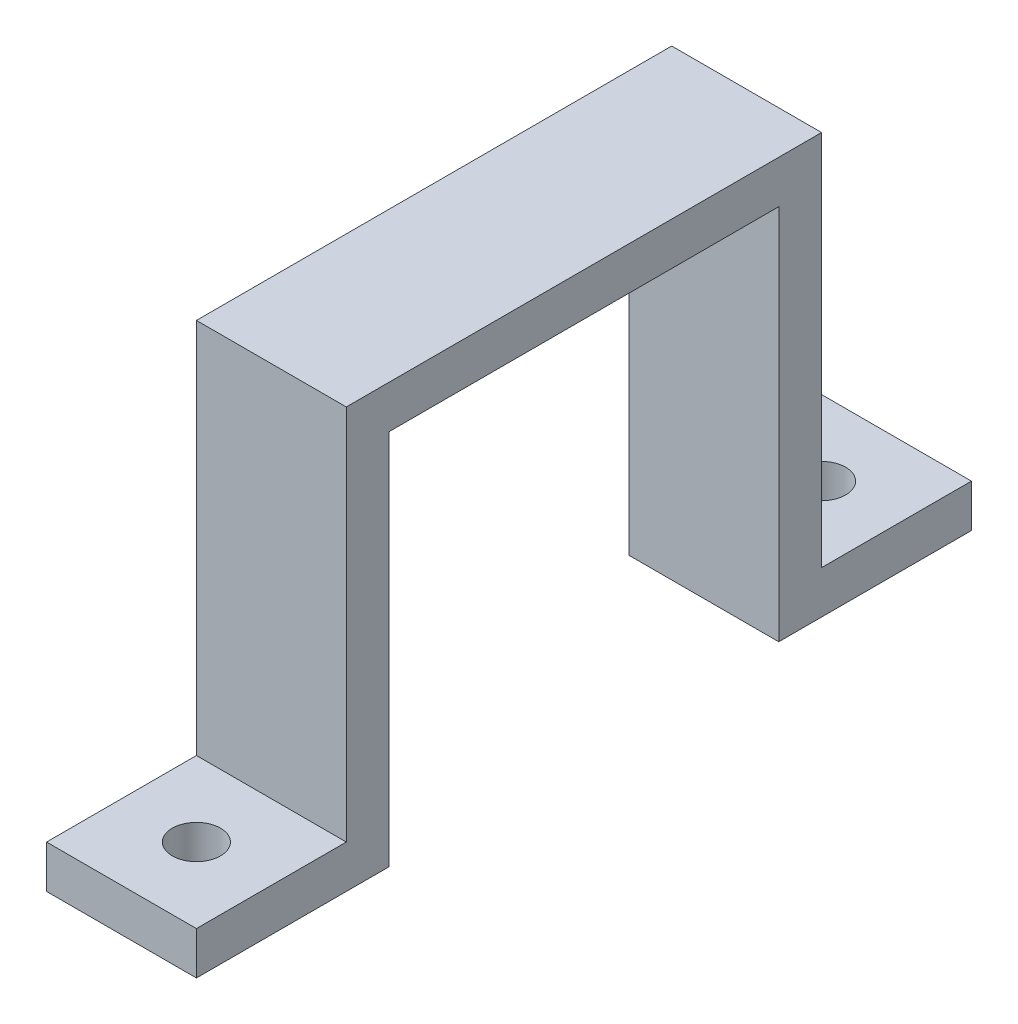
ISO-10303-21;
HEADER;
FILE_DESCRIPTION(('STEP AP214'),'2;1');
FILE_NAME('part.step','',(''),(''),'','','');
FILE_SCHEMA(('AUTOMOTIVE_DESIGN { 1 0 10303 214 1 1 1 1 }'));
ENDSEC;
DATA;
#1=APPLICATION_CONTEXT('core data for automotive mechanical design processes');
#2=APPLICATION_PROTOCOL_DEFINITION('international standard','automotive_design',2000,#1);
#3=PRODUCT_CONTEXT('',#1,'mechanical');
#4=PRODUCT('Part','Part','',(#3));
#5=PRODUCT_RELATED_PRODUCT_CATEGORY('part','',(#4));
#6=PRODUCT_DEFINITION_FORMATION('','',#4);
#7=PRODUCT_DEFINITION_CONTEXT('part definition',#1,'design');
#8=PRODUCT_DEFINITION('design','',#6,#7);
#9=PRODUCT_DEFINITION_SHAPE('','',#8);
#10=(LENGTH_UNIT() NAMED_UNIT(*) SI_UNIT(.MILLI.,.METRE.));
#11=(NAMED_UNIT(*) PLANE_ANGLE_UNIT() SI_UNIT($,.RADIAN.));
#12=(NAMED_UNIT(*) SI_UNIT($,.STERADIAN.) SOLID_ANGLE_UNIT());
#13=UNCERTAINTY_MEASURE_WITH_UNIT(LENGTH_MEASURE(1.E-05),#10,'distance_accuracy_value','');
#14=(GEOMETRIC_REPRESENTATION_CONTEXT(3) GLOBAL_UNCERTAINTY_ASSIGNED_CONTEXT((#13)) GLOBAL_UNIT_ASSIGNED_CONTEXT((#10,
#11,#12)) REPRESENTATION_CONTEXT('',''));
#15=CARTESIAN_POINT('',(0.,0.,0.));
#16=DIRECTION('',(0.,0.,1.));
#17=DIRECTION('',(1.,0.,0.));
#18=AXIS2_PLACEMENT_3D('',#15,#16,#17);
#19=CARTESIAN_POINT('',(7.,4.,36.2));
#20=DIRECTION('',(0.,0.,-1.));
#21=DIRECTION('',(-1.,0.,0.));
#22=AXIS2_PLACEMENT_3D('',#19,#20,#21);
#23=PLANE('',#22);
#24=DIRECTION('',(0.,-1.,0.));
#25=VECTOR('',#24,1.);
#26=CARTESIAN_POINT('',(-7.,4.,36.2));
#27=LINE('',#26,#25);
#28=CARTESIAN_POINT('',(-7.,4.,36.2));
#29=VERTEX_POINT('',#28);
#30=CARTESIAN_POINT('',(-7.,0.,36.2));
#31=VERTEX_POINT('',#30);
#32=EDGE_CURVE('E164',#29,#31,#27,.T.);
#33=ORIENTED_EDGE('',*,*,#32,.T.);
#34=DIRECTION('',(-1.,0.,0.));
#35=VECTOR('',#34,1.);
#36=CARTESIAN_POINT('',(7.,0.,36.2));
#37=LINE('',#36,#35);
#38=CARTESIAN_POINT('',(7.,0.,36.2));
#39=VERTEX_POINT('',#38);
#40=EDGE_CURVE('E11',#39,#31,#37,.T.);
#41=ORIENTED_EDGE('',*,*,#40,.F.);
#42=DIRECTION('',(0.,-1.,0.));
#43=VECTOR('',#42,1.);
#44=CARTESIAN_POINT('',(7.,4.,36.2));
#45=LINE('',#44,#43);
#46=CARTESIAN_POINT('',(7.,4.,36.2));
#47=VERTEX_POINT('',#46);
#48=EDGE_CURVE('E189',#47,#39,#45,.T.);
#49=ORIENTED_EDGE('',*,*,#48,.F.);
#50=DIRECTION('',(-1.,0.,0.));
#51=VECTOR('',#50,1.);
#52=CARTESIAN_POINT('',(7.,4.,36.2));
#53=LINE('',#52,#51);
#54=EDGE_CURVE('E161',#47,#29,#53,.T.);
#55=ORIENTED_EDGE('',*,*,#54,.T.);
#56=EDGE_LOOP('',(#33,#41,#49,#55));
#57=FACE_BOUND('',#56,.T.);
#58=ADVANCED_FACE('F43',(#57),#23,.F.);
#59=CARTESIAN_POINT('',(7.,0.,36.2));
#60=DIRECTION('',(0.,1.,0.));
#61=DIRECTION('',(0.,0.,1.));
#62=AXIS2_PLACEMENT_3D('',#59,#60,#61);
#63=PLANE('',#62);
#64=CARTESIAN_POINT('',(0.,0.,29.2));
#65=DIRECTION('',(0.,1.,0.));
#66=DIRECTION('',(0.,0.,1.));
#67=AXIS2_PLACEMENT_3D('',#64,#65,#66);
#68=CIRCLE('',#67,2.25);
#69=CARTESIAN_POINT('',(0.,0.,31.45));
#70=VERTEX_POINT('',#69);
#71=EDGE_CURVE('E213',#70,#70,#68,.F.);
#72=ORIENTED_EDGE('',*,*,#71,.F.);
#73=EDGE_LOOP('',(#72));
#74=FACE_BOUND('',#73,.T.);
#75=DIRECTION('',(0.,0.,-1.));
#76=VECTOR('',#75,1.);
#77=CARTESIAN_POINT('',(-7.,0.,36.2));
#78=LINE('',#77,#76);
#79=CARTESIAN_POINT('',(-7.,0.,18.2));
#80=VERTEX_POINT('',#79);
#81=EDGE_CURVE('E169',#31,#80,#78,.T.);
#82=ORIENTED_EDGE('',*,*,#81,.T.);
#83=DIRECTION('',(-1.,0.,0.));
#84=VECTOR('',#83,1.);
#85=CARTESIAN_POINT('',(7.,0.,18.2));
#86=LINE('',#85,#84);
#87=CARTESIAN_POINT('',(7.,0.,18.2));
#88=VERTEX_POINT('',#87);
#89=EDGE_CURVE('E55',#88,#80,#86,.T.);
#90=ORIENTED_EDGE('',*,*,#89,.F.);
#91=DIRECTION('',(0.,0.,-1.));
#92=VECTOR('',#91,1.);
#93=CARTESIAN_POINT('',(7.,0.,36.2));
#94=LINE('',#93,#92);
#95=EDGE_CURVE('E116',#39,#88,#94,.T.);
#96=ORIENTED_EDGE('',*,*,#95,.F.);
#97=ORIENTED_EDGE('',*,*,#40,.T.);
#98=EDGE_LOOP('',(#82,#90,#96,#97));
#99=FACE_BOUND('',#98,.T.);
#100=ADVANCED_FACE('F268',(#74,#99),#63,.F.);
#101=CARTESIAN_POINT('',(7.,0.,18.2));
#102=DIRECTION('',(0.,0.,1.));
#103=DIRECTION('',(1.,0.,0.));
#104=AXIS2_PLACEMENT_3D('',#101,#102,#103);
#105=PLANE('',#104);
#106=DIRECTION('',(0.,1.,0.));
#107=VECTOR('',#106,1.);
#108=CARTESIAN_POINT('',(-7.,0.,18.2));
#109=LINE('',#108,#107);
#110=CARTESIAN_POINT('',(-7.,35.2,18.2));
#111=VERTEX_POINT('',#110);
#112=EDGE_CURVE('E171',#80,#111,#109,.T.);
#113=ORIENTED_EDGE('',*,*,#112,.T.);
#114=DIRECTION('',(-1.,0.,0.));
#115=VECTOR('',#114,1.);
#116=CARTESIAN_POINT('',(7.,35.2,18.2));
#117=LINE('',#116,#115);
#118=CARTESIAN_POINT('',(7.,35.2,18.2));
#119=VERTEX_POINT('',#118);
#120=EDGE_CURVE('E210',#119,#111,#117,.T.);
#121=ORIENTED_EDGE('',*,*,#120,.F.);
#122=DIRECTION('',(0.,1.,0.));
#123=VECTOR('',#122,1.);
#124=CARTESIAN_POINT('',(7.,0.,18.2));
#125=LINE('',#124,#123);
#126=EDGE_CURVE('E226',#88,#119,#125,.T.);
#127=ORIENTED_EDGE('',*,*,#126,.F.);
#128=ORIENTED_EDGE('',*,*,#89,.T.);
#129=EDGE_LOOP('',(#113,#121,#127,#128));
#130=FACE_BOUND('',#129,.T.);
#131=ADVANCED_FACE('F272',(#130),#105,.F.);
#132=CARTESIAN_POINT('',(7.,35.2,18.2));
#133=DIRECTION('',(0.,1.,0.));
#134=DIRECTION('',(0.,0.,1.));
#135=AXIS2_PLACEMENT_3D('',#132,#133,#134);
#136=PLANE('',#135);
#137=DIRECTION('',(0.,0.,-1.));
#138=VECTOR('',#137,1.);
#139=CARTESIAN_POINT('',(-7.,35.2,18.2));
#140=LINE('',#139,#138);
#141=CARTESIAN_POINT('',(-7.,35.2,-18.2));
#142=VERTEX_POINT('',#141);
#143=EDGE_CURVE('E174',#111,#142,#140,.T.);
#144=ORIENTED_EDGE('',*,*,#143,.T.);
#145=DIRECTION('',(-1.,0.,0.));
#146=VECTOR('',#145,1.);
#147=CARTESIAN_POINT('',(7.,35.2,-18.2));
#148=LINE('',#147,#146);
#149=CARTESIAN_POINT('',(7.,35.2,-18.2));
#150=VERTEX_POINT('',#149);
#151=EDGE_CURVE('E204',#150,#142,#148,.T.);
#152=ORIENTED_EDGE('',*,*,#151,.F.);
#153=DIRECTION('',(0.,0.,-1.));
#154=VECTOR('',#153,1.);
#155=CARTESIAN_POINT('',(7.,35.2,18.2));
#156=LINE('',#155,#154);
#157=EDGE_CURVE('E229',#119,#150,#156,.T.);
#158=ORIENTED_EDGE('',*,*,#157,.F.);
#159=ORIENTED_EDGE('',*,*,#120,.T.);
#160=EDGE_LOOP('',(#144,#152,#158,#159));
#161=FACE_BOUND('',#160,.T.);
#162=ADVANCED_FACE('F276',(#161),#136,.F.);
#163=CARTESIAN_POINT('',(7.,35.2,-18.2));
#164=DIRECTION('',(0.,0.,-1.));
#165=DIRECTION('',(-1.,0.,0.));
#166=AXIS2_PLACEMENT_3D('',#163,#164,#165);
#167=PLANE('',#166);
#168=DIRECTION('',(0.,-1.,0.));
#169=VECTOR('',#168,1.);
#170=CARTESIAN_POINT('',(-7.,35.2,-18.2));
#171=LINE('',#170,#169);
#172=CARTESIAN_POINT('',(-7.,0.,-18.2));
#173=VERTEX_POINT('',#172);
#174=EDGE_CURVE('E175',#142,#173,#171,.T.);
#175=ORIENTED_EDGE('',*,*,#174,.T.);
#176=DIRECTION('',(-1.,0.,0.));
#177=VECTOR('',#176,1.);
#178=CARTESIAN_POINT('',(7.,0.,-18.2));
#179=LINE('',#178,#177);
#180=CARTESIAN_POINT('',(7.,0.,-18.2));
#181=VERTEX_POINT('',#180);
#182=EDGE_CURVE('E203',#181,#173,#179,.T.);
#183=ORIENTED_EDGE('',*,*,#182,.F.);
#184=DIRECTION('',(0.,-1.,0.));
#185=VECTOR('',#184,1.);
#186=CARTESIAN_POINT('',(7.,35.2,-18.2));
#187=LINE('',#186,#185);
#188=EDGE_CURVE('E230',#150,#181,#187,.T.);
#189=ORIENTED_EDGE('',*,*,#188,.F.);
#190=ORIENTED_EDGE('',*,*,#151,.T.);
#191=EDGE_LOOP('',(#175,#183,#189,#190));
#192=FACE_BOUND('',#191,.T.);
#193=ADVANCED_FACE('F285',(#192),#167,.F.);
#194=CARTESIAN_POINT('',(7.,0.,-18.2));
#195=DIRECTION('',(0.,1.,0.));
#196=DIRECTION('',(0.,0.,1.));
#197=AXIS2_PLACEMENT_3D('',#194,#195,#196);
#198=PLANE('',#197);
#199=CARTESIAN_POINT('',(0.,0.,-29.2));
#200=DIRECTION('',(0.,1.,0.));
#201=DIRECTION('',(0.,0.,1.));
#202=AXIS2_PLACEMENT_3D('',#199,#200,#201);
#203=CIRCLE('',#202,2.25);
#204=CARTESIAN_POINT('',(0.,0.,-26.95));
#205=VERTEX_POINT('',#204);
#206=EDGE_CURVE('E166',#205,#205,#203,.F.);
#207=ORIENTED_EDGE('',*,*,#206,.F.);
#208=EDGE_LOOP('',(#207));
#209=FACE_BOUND('',#208,.T.);
#210=DIRECTION('',(0.,0.,-1.));
#211=VECTOR('',#210,1.);
#212=CARTESIAN_POINT('',(-7.,0.,-18.2));
#213=LINE('',#212,#211);
#214=CARTESIAN_POINT('',(-7.,0.,-36.2));
#215=VERTEX_POINT('',#214);
#216=EDGE_CURVE('E180',#173,#215,#213,.T.);
#217=ORIENTED_EDGE('',*,*,#216,.T.);
#218=DIRECTION('',(-1.,0.,0.));
#219=VECTOR('',#218,1.);
#220=CARTESIAN_POINT('',(7.,0.,-36.2));
#221=LINE('',#220,#219);
#222=CARTESIAN_POINT('',(7.,0.,-36.2));
#223=VERTEX_POINT('',#222);
#224=EDGE_CURVE('E196',#223,#215,#221,.T.);
#225=ORIENTED_EDGE('',*,*,#224,.F.);
#226=DIRECTION('',(0.,0.,-1.));
#227=VECTOR('',#226,1.);
#228=CARTESIAN_POINT('',(7.,0.,-18.2));
#229=LINE('',#228,#227);
#230=EDGE_CURVE('E235',#181,#223,#229,.T.);
#231=ORIENTED_EDGE('',*,*,#230,.F.);
#232=ORIENTED_EDGE('',*,*,#182,.T.);
#233=EDGE_LOOP('',(#217,#225,#231,#232));
#234=FACE_BOUND('',#233,.T.);
#235=ADVANCED_FACE('F289',(#209,#234),#198,.F.);
#236=CARTESIAN_POINT('',(7.,0.,-36.2));
#237=DIRECTION('',(0.,0.,1.));
#238=DIRECTION('',(1.,0.,0.));
#239=AXIS2_PLACEMENT_3D('',#236,#237,#238);
#240=PLANE('',#239);
#241=DIRECTION('',(0.,1.,0.));
#242=VECTOR('',#241,1.);
#243=CARTESIAN_POINT('',(-7.,0.,-36.2));
#244=LINE('',#243,#242);
#245=CARTESIAN_POINT('',(-7.,4.,-36.2));
#246=VERTEX_POINT('',#245);
#247=EDGE_CURVE('E179',#215,#246,#244,.T.);
#248=ORIENTED_EDGE('',*,*,#247,.T.);
#249=DIRECTION('',(-1.,0.,0.));
#250=VECTOR('',#249,1.);
#251=CARTESIAN_POINT('',(7.,4.,-36.2));
#252=LINE('',#251,#250);
#253=CARTESIAN_POINT('',(7.,4.,-36.2));
#254=VERTEX_POINT('',#253);
#255=EDGE_CURVE('E192',#254,#246,#252,.T.);
#256=ORIENTED_EDGE('',*,*,#255,.F.);
#257=DIRECTION('',(0.,1.,0.));
#258=VECTOR('',#257,1.);
#259=CARTESIAN_POINT('',(7.,0.,-36.2));
#260=LINE('',#259,#258);
#261=EDGE_CURVE('E234',#223,#254,#260,.T.);
#262=ORIENTED_EDGE('',*,*,#261,.F.);
#263=ORIENTED_EDGE('',*,*,#224,.T.);
#264=EDGE_LOOP('',(#248,#256,#262,#263));
#265=FACE_BOUND('',#264,.T.);
#266=ADVANCED_FACE('F295',(#265),#240,.F.);
#267=CARTESIAN_POINT('',(7.,4.,-36.2));
#268=DIRECTION('',(0.,-1.,0.));
#269=DIRECTION('',(0.,0.,-1.));
#270=AXIS2_PLACEMENT_3D('',#267,#268,#269);
#271=PLANE('',#270);
#272=CARTESIAN_POINT('',(0.,4.,-29.2));
#273=DIRECTION('',(0.,-1.,0.));
#274=DIRECTION('',(0.,0.,-1.));
#275=AXIS2_PLACEMENT_3D('',#272,#273,#274);
#276=CIRCLE('',#275,2.25);
#277=CARTESIAN_POINT('',(0.,4.,-31.45));
#278=VERTEX_POINT('',#277);
#279=EDGE_CURVE('E46',#278,#278,#276,.F.);
#280=ORIENTED_EDGE('',*,*,#279,.F.);
#281=EDGE_LOOP('',(#280));
#282=FACE_BOUND('',#281,.T.);
#283=DIRECTION('',(0.,0.,1.));
#284=VECTOR('',#283,1.);
#285=CARTESIAN_POINT('',(-7.,4.,-36.2));
#286=LINE('',#285,#284);
#287=CARTESIAN_POINT('',(-7.,4.,-22.2));
#288=VERTEX_POINT('',#287);
#289=EDGE_CURVE('E182',#246,#288,#286,.T.);
#290=ORIENTED_EDGE('',*,*,#289,.T.);
#291=DIRECTION('',(-1.,0.,0.));
#292=VECTOR('',#291,1.);
#293=CARTESIAN_POINT('',(7.,4.,-22.2));
#294=LINE('',#293,#292);
#295=CARTESIAN_POINT('',(7.,4.,-22.2));
#296=VERTEX_POINT('',#295);
#297=EDGE_CURVE('E195',#296,#288,#294,.T.);
#298=ORIENTED_EDGE('',*,*,#297,.F.);
#299=DIRECTION('',(0.,0.,1.));
#300=VECTOR('',#299,1.);
#301=CARTESIAN_POINT('',(7.,4.,-36.2));
#302=LINE('',#301,#300);
#303=EDGE_CURVE('E237',#254,#296,#302,.T.);
#304=ORIENTED_EDGE('',*,*,#303,.F.);
#305=ORIENTED_EDGE('',*,*,#255,.T.);
#306=EDGE_LOOP('',(#290,#298,#304,#305));
#307=FACE_BOUND('',#306,.T.);
#308=ADVANCED_FACE('F242',(#282,#307),#271,.F.);
#309=CARTESIAN_POINT('',(7.,4.,-22.2));
#310=DIRECTION('',(0.,0.,1.));
#311=DIRECTION('',(1.,0.,0.));
#312=AXIS2_PLACEMENT_3D('',#309,#310,#311);
#313=PLANE('',#312);
#314=DIRECTION('',(0.,1.,0.));
#315=VECTOR('',#314,1.);
#316=CARTESIAN_POINT('',(-7.,4.,-22.2));
#317=LINE('',#316,#315);
#318=CARTESIAN_POINT('',(-7.,39.2,-22.2));
#319=VERTEX_POINT('',#318);
#320=EDGE_CURVE('E181',#288,#319,#317,.T.);
#321=ORIENTED_EDGE('',*,*,#320,.T.);
#322=DIRECTION('',(-1.,0.,0.));
#323=VECTOR('',#322,1.);
#324=CARTESIAN_POINT('',(7.,39.2,-22.2));
#325=LINE('',#324,#323);
#326=CARTESIAN_POINT('',(7.,39.2,-22.2));
#327=VERTEX_POINT('',#326);
#328=EDGE_CURVE('E156',#327,#319,#325,.T.);
#329=ORIENTED_EDGE('',*,*,#328,.F.);
#330=DIRECTION('',(0.,1.,0.));
#331=VECTOR('',#330,1.);
#332=CARTESIAN_POINT('',(7.,4.,-22.2));
#333=LINE('',#332,#331);
#334=EDGE_CURVE('E150',#296,#327,#333,.T.);
#335=ORIENTED_EDGE('',*,*,#334,.F.);
#336=ORIENTED_EDGE('',*,*,#297,.T.);
#337=EDGE_LOOP('',(#321,#329,#335,#336));
#338=FACE_BOUND('',#337,.T.);
#339=ADVANCED_FACE('F248',(#338),#313,.F.);
#340=CARTESIAN_POINT('',(7.,39.2,-22.2));
#341=DIRECTION('',(0.,-1.,0.));
#342=DIRECTION('',(0.,0.,-1.));
#343=AXIS2_PLACEMENT_3D('',#340,#341,#342);
#344=PLANE('',#343);
#345=DIRECTION('',(0.,0.,1.));
#346=VECTOR('',#345,1.);
#347=CARTESIAN_POINT('',(-7.,39.2,-22.2));
#348=LINE('',#347,#346);
#349=CARTESIAN_POINT('',(-7.,39.2,22.2));
#350=VERTEX_POINT('',#349);
#351=EDGE_CURVE('E154',#319,#350,#348,.T.);
#352=ORIENTED_EDGE('',*,*,#351,.T.);
#353=DIRECTION('',(-1.,0.,0.));
#354=VECTOR('',#353,1.);
#355=CARTESIAN_POINT('',(7.,39.2,22.2));
#356=LINE('',#355,#354);
#357=CARTESIAN_POINT('',(7.,39.2,22.2));
#358=VERTEX_POINT('',#357);
#359=EDGE_CURVE('E155',#358,#350,#356,.T.);
#360=ORIENTED_EDGE('',*,*,#359,.F.);
#361=DIRECTION('',(0.,0.,1.));
#362=VECTOR('',#361,1.);
#363=CARTESIAN_POINT('',(7.,39.2,-22.2));
#364=LINE('',#363,#362);
#365=EDGE_CURVE('E143',#327,#358,#364,.T.);
#366=ORIENTED_EDGE('',*,*,#365,.F.);
#367=ORIENTED_EDGE('',*,*,#328,.T.);
#368=EDGE_LOOP('',(#352,#360,#366,#367));
#369=FACE_BOUND('',#368,.T.);
#370=ADVANCED_FACE('F153',(#369),#344,.F.);
#371=CARTESIAN_POINT('',(7.,39.2,22.2));
#372=DIRECTION('',(0.,0.,-1.));
#373=DIRECTION('',(-1.,0.,0.));
#374=AXIS2_PLACEMENT_3D('',#371,#372,#373);
#375=PLANE('',#374);
#376=DIRECTION('',(0.,-1.,0.));
#377=VECTOR('',#376,1.);
#378=CARTESIAN_POINT('',(-7.,39.2,22.2));
#379=LINE('',#378,#377);
#380=CARTESIAN_POINT('',(-7.,4.,22.2));
#381=VERTEX_POINT('',#380);
#382=EDGE_CURVE('E105',#350,#381,#379,.T.);
#383=ORIENTED_EDGE('',*,*,#382,.T.);
#384=DIRECTION('',(-1.,0.,0.));
#385=VECTOR('',#384,1.);
#386=CARTESIAN_POINT('',(7.,4.,22.2));
#387=LINE('',#386,#385);
#388=CARTESIAN_POINT('',(7.,4.,22.2));
#389=VERTEX_POINT('',#388);
#390=EDGE_CURVE('E160',#389,#381,#387,.T.);
#391=ORIENTED_EDGE('',*,*,#390,.F.);
#392=DIRECTION('',(0.,-1.,0.));
#393=VECTOR('',#392,1.);
#394=CARTESIAN_POINT('',(7.,39.2,22.2));
#395=LINE('',#394,#393);
#396=EDGE_CURVE('E144',#358,#389,#395,.T.);
#397=ORIENTED_EDGE('',*,*,#396,.F.);
#398=ORIENTED_EDGE('',*,*,#359,.T.);
#399=EDGE_LOOP('',(#383,#391,#397,#398));
#400=FACE_BOUND('',#399,.T.);
#401=ADVANCED_FACE('F157',(#400),#375,.F.);
#402=CARTESIAN_POINT('',(7.,4.,22.2));
#403=DIRECTION('',(0.,-1.,0.));
#404=DIRECTION('',(0.,0.,-1.));
#405=AXIS2_PLACEMENT_3D('',#402,#403,#404);
#406=PLANE('',#405);
#407=CARTESIAN_POINT('',(0.,4.,29.2));
#408=DIRECTION('',(0.,-1.,0.));
#409=DIRECTION('',(0.,0.,-1.));
#410=AXIS2_PLACEMENT_3D('',#407,#408,#409);
#411=CIRCLE('',#410,2.25);
#412=CARTESIAN_POINT('',(0.,4.,26.95));
#413=VERTEX_POINT('',#412);
#414=EDGE_CURVE('E211',#413,#413,#411,.F.);
#415=ORIENTED_EDGE('',*,*,#414,.F.);
#416=EDGE_LOOP('',(#415));
#417=FACE_BOUND('',#416,.T.);
#418=DIRECTION('',(0.,0.,1.));
#419=VECTOR('',#418,1.);
#420=CARTESIAN_POINT('',(-7.,4.,22.2));
#421=LINE('',#420,#419);
#422=EDGE_CURVE('E107',#381,#29,#421,.T.);
#423=ORIENTED_EDGE('',*,*,#422,.T.);
#424=ORIENTED_EDGE('',*,*,#54,.F.);
#425=DIRECTION('',(0.,0.,1.));
#426=VECTOR('',#425,1.);
#427=CARTESIAN_POINT('',(7.,4.,22.2));
#428=LINE('',#427,#426);
#429=EDGE_CURVE('E61',#389,#47,#428,.T.);
#430=ORIENTED_EDGE('',*,*,#429,.F.);
#431=ORIENTED_EDGE('',*,*,#390,.T.);
#432=EDGE_LOOP('',(#423,#424,#430,#431));
#433=FACE_BOUND('',#432,.T.);
#434=ADVANCED_FACE('F255',(#417,#433),#406,.F.);
#435=CARTESIAN_POINT('',(7.,0.,0.));
#436=DIRECTION('',(1.,0.,0.));
#437=DIRECTION('',(0.,0.,-1.));
#438=AXIS2_PLACEMENT_3D('',#435,#436,#437);
#439=PLANE('',#438);
#440=ORIENTED_EDGE('',*,*,#48,.T.);
#441=ORIENTED_EDGE('',*,*,#95,.T.);
#442=ORIENTED_EDGE('',*,*,#126,.T.);
#443=ORIENTED_EDGE('',*,*,#157,.T.);
#444=ORIENTED_EDGE('',*,*,#188,.T.);
#445=ORIENTED_EDGE('',*,*,#230,.T.);
#446=ORIENTED_EDGE('',*,*,#261,.T.);
#447=ORIENTED_EDGE('',*,*,#303,.T.);
#448=ORIENTED_EDGE('',*,*,#334,.T.);
#449=ORIENTED_EDGE('',*,*,#365,.T.);
#450=ORIENTED_EDGE('',*,*,#396,.T.);
#451=ORIENTED_EDGE('',*,*,#429,.T.);
#452=EDGE_LOOP('',(#440,#441,#442,#443,#444,#445,#446,#447,#448,#449,#450,#451));
#453=FACE_BOUND('',#452,.T.);
#454=ADVANCED_FACE('F141',(#453),#439,.T.);
#455=CARTESIAN_POINT('',(-7.,0.,0.));
#456=DIRECTION('',(1.,0.,0.));
#457=DIRECTION('',(0.,0.,-1.));
#458=AXIS2_PLACEMENT_3D('',#455,#456,#457);
#459=PLANE('',#458);
#460=ORIENTED_EDGE('',*,*,#32,.F.);
#461=ORIENTED_EDGE('',*,*,#422,.F.);
#462=ORIENTED_EDGE('',*,*,#382,.F.);
#463=ORIENTED_EDGE('',*,*,#351,.F.);
#464=ORIENTED_EDGE('',*,*,#320,.F.);
#465=ORIENTED_EDGE('',*,*,#289,.F.);
#466=ORIENTED_EDGE('',*,*,#247,.F.);
#467=ORIENTED_EDGE('',*,*,#216,.F.);
#468=ORIENTED_EDGE('',*,*,#174,.F.);
#469=ORIENTED_EDGE('',*,*,#143,.F.);
#470=ORIENTED_EDGE('',*,*,#112,.F.);
#471=ORIENTED_EDGE('',*,*,#81,.F.);
#472=EDGE_LOOP('',(#460,#461,#462,#463,#464,#465,#466,#467,#468,#469,#470,#471));
#473=FACE_BOUND('',#472,.T.);
#474=ADVANCED_FACE('F249',(#473),#459,.F.);
#475=CARTESIAN_POINT('',(0.,4.5,29.2));
#476=DIRECTION('',(0.,-1.,0.));
#477=DIRECTION('',(0.,0.,-1.));
#478=AXIS2_PLACEMENT_3D('',#475,#476,#477);
#479=CYLINDRICAL_SURFACE('',#478,2.25);
#480=ORIENTED_EDGE('',*,*,#414,.T.);
#481=EDGE_LOOP('',(#480));
#482=FACE_BOUND('',#481,.T.);
#483=ORIENTED_EDGE('',*,*,#71,.T.);
#484=EDGE_LOOP('',(#483));
#485=FACE_BOUND('',#484,.T.);
#486=ADVANCED_FACE('F321',(#482,#485),#479,.F.);
#487=CARTESIAN_POINT('',(0.,4.5,-29.2));
#488=DIRECTION('',(0.,-1.,0.));
#489=DIRECTION('',(0.,0.,-1.));
#490=AXIS2_PLACEMENT_3D('',#487,#488,#489);
#491=CYLINDRICAL_SURFACE('',#490,2.25);
#492=ORIENTED_EDGE('',*,*,#279,.T.);
#493=EDGE_LOOP('',(#492));
#494=FACE_BOUND('',#493,.T.);
#495=ORIENTED_EDGE('',*,*,#206,.T.);
#496=EDGE_LOOP('',(#495));
#497=FACE_BOUND('',#496,.T.);
#498=ADVANCED_FACE('F332',(#494,#497),#491,.F.);
#499=CLOSED_SHELL('',(#58,#100,#131,#162,#193,#235,#266,#308,#339,#370,#401,#434,#454,#474,#486,#498));
#500=MANIFOLD_SOLID_BREP('B2',#499);
#501=ADVANCED_BREP_SHAPE_REPRESENTATION('',(#18,#500),#14);
#502=SHAPE_DEFINITION_REPRESENTATION(#9,#501);
ENDSEC;
END-ISO-10303-21;
